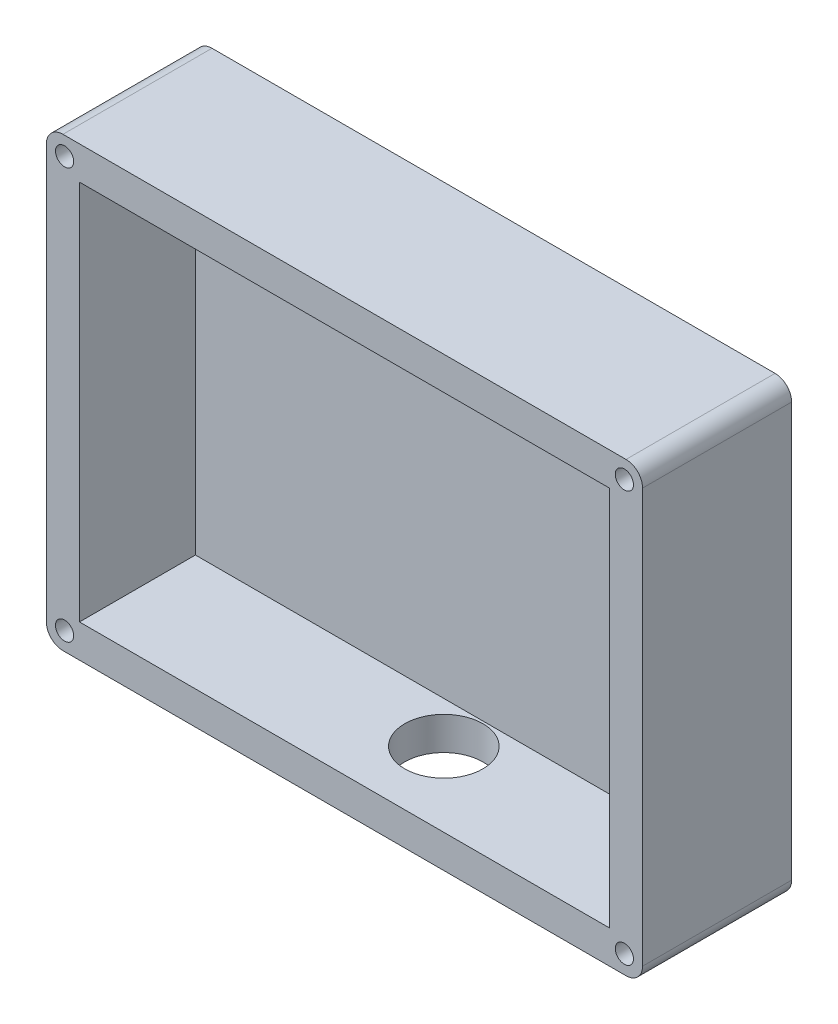
ISO-10303-21;
HEADER;
FILE_DESCRIPTION(('STEP AP214'),'2;1');
FILE_NAME('part.step','',(''),(''),'','','');
FILE_SCHEMA(('AUTOMOTIVE_DESIGN { 1 0 10303 214 1 1 1 1 }'));
ENDSEC;
DATA;
#1=APPLICATION_CONTEXT('core data for automotive mechanical design processes');
#2=APPLICATION_PROTOCOL_DEFINITION('international standard','automotive_design',2000,#1);
#3=PRODUCT_CONTEXT('',#1,'mechanical');
#4=PRODUCT('Part','Part','',(#3));
#5=PRODUCT_RELATED_PRODUCT_CATEGORY('part','',(#4));
#6=PRODUCT_DEFINITION_FORMATION('','',#4);
#7=PRODUCT_DEFINITION_CONTEXT('part definition',#1,'design');
#8=PRODUCT_DEFINITION('design','',#6,#7);
#9=PRODUCT_DEFINITION_SHAPE('','',#8);
#10=(LENGTH_UNIT() NAMED_UNIT(*) SI_UNIT(.MILLI.,.METRE.));
#11=(NAMED_UNIT(*) PLANE_ANGLE_UNIT() SI_UNIT($,.RADIAN.));
#12=(NAMED_UNIT(*) SI_UNIT($,.STERADIAN.) SOLID_ANGLE_UNIT());
#13=UNCERTAINTY_MEASURE_WITH_UNIT(LENGTH_MEASURE(1.E-05),#10,'distance_accuracy_value','');
#14=(GEOMETRIC_REPRESENTATION_CONTEXT(3) GLOBAL_UNCERTAINTY_ASSIGNED_CONTEXT((#13)) GLOBAL_UNIT_ASSIGNED_CONTEXT((#10,
#11,#12)) REPRESENTATION_CONTEXT('',''));
#15=CARTESIAN_POINT('',(0.,0.,0.));
#16=DIRECTION('',(0.,0.,1.));
#17=DIRECTION('',(1.,0.,0.));
#18=AXIS2_PLACEMENT_3D('',#15,#16,#17);
#19=CARTESIAN_POINT('',(0.,0.,-20.32));
#20=DIRECTION('',(0.,0.,-1.));
#21=DIRECTION('',(-1.,0.,0.));
#22=AXIS2_PLACEMENT_3D('',#19,#20,#21);
#23=PLANE('',#22);
#24=CARTESIAN_POINT('',(64.9097,-34.29,-20.32));
#25=DIRECTION('',(0.,0.,-1.));
#26=DIRECTION('',(-1.,0.,0.));
#27=AXIS2_PLACEMENT_3D('',#24,#25,#26);
#28=CIRCLE('',#27,1.26999999999999);
#29=CARTESIAN_POINT('',(63.6397,-34.29,-20.32));
#30=VERTEX_POINT('',#29);
#31=EDGE_CURVE('E425',#30,#30,#28,.T.);
#32=ORIENTED_EDGE('',*,*,#31,.F.);
#33=EDGE_LOOP('',(#32));
#34=FACE_BOUND('',#33,.T.);
#35=DIRECTION('',(0.,-1.,0.));
#36=VECTOR('',#35,1.);
#37=CARTESIAN_POINT('',(58.7121,0.,-20.32));
#38=LINE('',#37,#36);
#39=CARTESIAN_POINT('',(58.7121,-26.3525,-20.32));
#40=VERTEX_POINT('',#39);
#41=CARTESIAN_POINT('',(58.7121,-42.2275,-20.32));
#42=VERTEX_POINT('',#41);
#43=EDGE_CURVE('E178',#40,#42,#38,.T.);
#44=ORIENTED_EDGE('',*,*,#43,.F.);
#45=DIRECTION('',(1.,0.,0.));
#46=VECTOR('',#45,1.);
#47=CARTESIAN_POINT('',(20.32,-26.3525,-20.32));
#48=LINE('',#47,#46);
#49=CARTESIAN_POINT('',(71.12,-26.3525,-20.32));
#50=VERTEX_POINT('',#49);
#51=EDGE_CURVE('E447',#40,#50,#48,.T.);
#52=ORIENTED_EDGE('',*,*,#51,.T.);
#53=DIRECTION('',(0.,-1.,0.));
#54=VECTOR('',#53,1.);
#55=CARTESIAN_POINT('',(71.12,-42.2275,-20.32));
#56=LINE('',#55,#54);
#57=CARTESIAN_POINT('',(71.12,-42.2275,-20.32));
#58=VERTEX_POINT('',#57);
#59=EDGE_CURVE('E203',#50,#58,#56,.T.);
#60=ORIENTED_EDGE('',*,*,#59,.T.);
#61=DIRECTION('',(-1.,0.,0.));
#62=VECTOR('',#61,1.);
#63=CARTESIAN_POINT('',(20.32,-42.2275,-20.32));
#64=LINE('',#63,#62);
#65=EDGE_CURVE('E196',#58,#42,#64,.T.);
#66=ORIENTED_EDGE('',*,*,#65,.T.);
#67=EDGE_LOOP('',(#44,#52,#60,#66));
#68=FACE_BOUND('',#67,.T.);
#69=ADVANCED_FACE('F39',(#34,#68),#23,.T.);
#70=CARTESIAN_POINT('',(0.,0.,0.));
#71=DIRECTION('',(0.,0.,1.));
#72=DIRECTION('',(1.,0.,0.));
#73=AXIS2_PLACEMENT_3D('',#70,#71,#72);
#74=PLANE('',#73);
#75=DIRECTION('',(1.,0.,0.));
#76=VECTOR('',#75,1.);
#77=CARTESIAN_POINT('',(20.32,-23.8125,0.));
#78=LINE('',#77,#76);
#79=CARTESIAN_POINT('',(73.66,-23.8125,0.));
#80=VERTEX_POINT('',#79);
#81=CARTESIAN_POINT('',(17.78,-23.8125,0.));
#82=VERTEX_POINT('',#81);
#83=EDGE_CURVE('E394',#80,#82,#78,.F.);
#84=ORIENTED_EDGE('',*,*,#83,.T.);
#85=DIRECTION('',(0.,1.,0.));
#86=VECTOR('',#85,1.);
#87=CARTESIAN_POINT('',(17.78,-42.2275,0.));
#88=LINE('',#87,#86);
#89=CARTESIAN_POINT('',(17.78,-44.7675,0.));
#90=VERTEX_POINT('',#89);
#91=EDGE_CURVE('E403',#82,#90,#88,.F.);
#92=ORIENTED_EDGE('',*,*,#91,.T.);
#93=DIRECTION('',(-1.,0.,0.));
#94=VECTOR('',#93,1.);
#95=CARTESIAN_POINT('',(71.12,-44.7675,0.));
#96=LINE('',#95,#94);
#97=CARTESIAN_POINT('',(73.66,-44.7675,0.));
#98=VERTEX_POINT('',#97);
#99=EDGE_CURVE('E400',#90,#98,#96,.F.);
#100=ORIENTED_EDGE('',*,*,#99,.T.);
#101=DIRECTION('',(0.,-1.,0.));
#102=VECTOR('',#101,1.);
#103=CARTESIAN_POINT('',(73.66,-26.3525,0.));
#104=LINE('',#103,#102);
#105=EDGE_CURVE('E397',#98,#80,#104,.F.);
#106=ORIENTED_EDGE('',*,*,#105,.T.);
#107=EDGE_LOOP('',(#84,#92,#100,#106));
#108=FACE_BOUND('',#107,.T.);
#109=DIRECTION('',(1.,0.,0.));
#110=VECTOR('',#109,1.);
#111=CARTESIAN_POINT('',(0.,-68.58,0.));
#112=LINE('',#111,#110);
#113=CARTESIAN_POINT('',(2.54000000000001,-68.58,0.));
#114=VERTEX_POINT('',#113);
#115=CARTESIAN_POINT('',(88.9,-68.58,0.));
#116=VERTEX_POINT('',#115);
#117=EDGE_CURVE('E327',#114,#116,#112,.T.);
#118=ORIENTED_EDGE('',*,*,#117,.F.);
#119=CARTESIAN_POINT('',(2.54000000000001,-66.04,0.));
#120=DIRECTION('',(0.,0.,1.));
#121=DIRECTION('',(1.,0.,0.));
#122=AXIS2_PLACEMENT_3D('',#119,#120,#121);
#123=CIRCLE('',#122,2.54);
#124=CARTESIAN_POINT('',(0.,-66.04,0.));
#125=VERTEX_POINT('',#124);
#126=EDGE_CURVE('E353',#114,#125,#123,.F.);
#127=ORIENTED_EDGE('',*,*,#126,.T.);
#128=DIRECTION('',(0.,-1.,0.));
#129=VECTOR('',#128,1.);
#130=CARTESIAN_POINT('',(0.,0.,0.));
#131=LINE('',#130,#129);
#132=CARTESIAN_POINT('',(0.,-2.54,0.));
#133=VERTEX_POINT('',#132);
#134=EDGE_CURVE('E272',#133,#125,#131,.T.);
#135=ORIENTED_EDGE('',*,*,#134,.F.);
#136=CARTESIAN_POINT('',(2.54,-2.54,0.));
#137=DIRECTION('',(0.,0.,1.));
#138=DIRECTION('',(1.,0.,0.));
#139=AXIS2_PLACEMENT_3D('',#136,#137,#138);
#140=CIRCLE('',#139,2.54);
#141=CARTESIAN_POINT('',(2.54,0.,0.));
#142=VERTEX_POINT('',#141);
#143=EDGE_CURVE('E350',#133,#142,#140,.F.);
#144=ORIENTED_EDGE('',*,*,#143,.T.);
#145=DIRECTION('',(-1.,0.,0.));
#146=VECTOR('',#145,1.);
#147=CARTESIAN_POINT('',(0.,0.,0.));
#148=LINE('',#147,#146);
#149=CARTESIAN_POINT('',(88.9,0.,0.));
#150=VERTEX_POINT('',#149);
#151=EDGE_CURVE('E311',#150,#142,#148,.T.);
#152=ORIENTED_EDGE('',*,*,#151,.F.);
#153=CARTESIAN_POINT('',(88.9,-2.54,0.));
#154=DIRECTION('',(0.,0.,1.));
#155=DIRECTION('',(1.,0.,0.));
#156=AXIS2_PLACEMENT_3D('',#153,#154,#155);
#157=CIRCLE('',#156,2.54);
#158=CARTESIAN_POINT('',(91.44,-2.54,0.));
#159=VERTEX_POINT('',#158);
#160=EDGE_CURVE('E347',#150,#159,#157,.F.);
#161=ORIENTED_EDGE('',*,*,#160,.T.);
#162=DIRECTION('',(0.,1.,0.));
#163=VECTOR('',#162,1.);
#164=CARTESIAN_POINT('',(91.44,0.,0.));
#165=LINE('',#164,#163);
#166=CARTESIAN_POINT('',(91.44,-66.04,0.));
#167=VERTEX_POINT('',#166);
#168=EDGE_CURVE('E331',#167,#159,#165,.T.);
#169=ORIENTED_EDGE('',*,*,#168,.F.);
#170=CARTESIAN_POINT('',(88.9,-66.04,0.));
#171=DIRECTION('',(0.,0.,1.));
#172=DIRECTION('',(1.,0.,0.));
#173=AXIS2_PLACEMENT_3D('',#170,#171,#172);
#174=CIRCLE('',#173,2.54);
#175=EDGE_CURVE('E344',#167,#116,#174,.F.);
#176=ORIENTED_EDGE('',*,*,#175,.T.);
#177=EDGE_LOOP('',(#118,#127,#135,#144,#152,#161,#169,#176));
#178=FACE_BOUND('',#177,.T.);
#179=ADVANCED_FACE('F482',(#108,#178),#74,.F.);
#180=CARTESIAN_POINT('',(0.,0.,22.86));
#181=DIRECTION('',(1.,0.,0.));
#182=DIRECTION('',(0.,1.,0.));
#183=AXIS2_PLACEMENT_3D('',#180,#181,#182);
#184=PLANE('',#183);
#185=ORIENTED_EDGE('',*,*,#134,.T.);
#186=DIRECTION('',(0.,0.,-1.));
#187=VECTOR('',#186,1.);
#188=CARTESIAN_POINT('',(0.,-66.04,22.86));
#189=LINE('',#188,#187);
#190=CARTESIAN_POINT('',(0.,-66.04,22.86));
#191=VERTEX_POINT('',#190);
#192=EDGE_CURVE('E360',#125,#191,#189,.F.);
#193=ORIENTED_EDGE('',*,*,#192,.T.);
#194=DIRECTION('',(0.,-1.,0.));
#195=VECTOR('',#194,1.);
#196=CARTESIAN_POINT('',(0.,0.,22.86));
#197=LINE('',#196,#195);
#198=CARTESIAN_POINT('',(0.,-2.54,22.86));
#199=VERTEX_POINT('',#198);
#200=EDGE_CURVE('E306',#199,#191,#197,.T.);
#201=ORIENTED_EDGE('',*,*,#200,.F.);
#202=DIRECTION('',(0.,0.,-1.));
#203=VECTOR('',#202,1.);
#204=CARTESIAN_POINT('',(0.,-2.54,22.86));
#205=LINE('',#204,#203);
#206=EDGE_CURVE('E356',#199,#133,#205,.T.);
#207=ORIENTED_EDGE('',*,*,#206,.T.);
#208=EDGE_LOOP('',(#185,#193,#201,#207));
#209=FACE_BOUND('',#208,.T.);
#210=ADVANCED_FACE('F489',(#209),#184,.F.);
#211=CARTESIAN_POINT('',(0.,-68.58,22.86));
#212=DIRECTION('',(0.,1.,0.));
#213=DIRECTION('',(0.,0.,1.));
#214=AXIS2_PLACEMENT_3D('',#211,#212,#213);
#215=PLANE('',#214);
#216=CARTESIAN_POINT('',(49.53,-68.58,11.43));
#217=DIRECTION('',(0.,-1.,0.));
#218=DIRECTION('',(0.,0.,-1.));
#219=AXIS2_PLACEMENT_3D('',#216,#217,#218);
#220=CIRCLE('',#219,5.99999999999999);
#221=CARTESIAN_POINT('',(49.53,-68.58,5.43));
#222=VERTEX_POINT('',#221);
#223=EDGE_CURVE('E223',#222,#222,#220,.T.);
#224=ORIENTED_EDGE('',*,*,#223,.F.);
#225=EDGE_LOOP('',(#224));
#226=FACE_BOUND('',#225,.T.);
#227=DIRECTION('',(1.,0.,0.));
#228=VECTOR('',#227,1.);
#229=CARTESIAN_POINT('',(0.,-68.58,22.86));
#230=LINE('',#229,#228);
#231=CARTESIAN_POINT('',(2.54000000000001,-68.58,22.86));
#232=VERTEX_POINT('',#231);
#233=CARTESIAN_POINT('',(88.9,-68.58,22.86));
#234=VERTEX_POINT('',#233);
#235=EDGE_CURVE('E310',#232,#234,#230,.T.);
#236=ORIENTED_EDGE('',*,*,#235,.F.);
#237=DIRECTION('',(0.,0.,-1.));
#238=VECTOR('',#237,1.);
#239=CARTESIAN_POINT('',(2.54000000000001,-68.58,22.86));
#240=LINE('',#239,#238);
#241=EDGE_CURVE('E340',#232,#114,#240,.T.);
#242=ORIENTED_EDGE('',*,*,#241,.T.);
#243=ORIENTED_EDGE('',*,*,#117,.T.);
#244=DIRECTION('',(0.,0.,-1.));
#245=VECTOR('',#244,1.);
#246=CARTESIAN_POINT('',(88.9,-68.58,22.86));
#247=LINE('',#246,#245);
#248=EDGE_CURVE('E323',#116,#234,#247,.F.);
#249=ORIENTED_EDGE('',*,*,#248,.T.);
#250=EDGE_LOOP('',(#236,#242,#243,#249));
#251=FACE_BOUND('',#250,.T.);
#252=ADVANCED_FACE('F497',(#226,#251),#215,.F.);
#253=CARTESIAN_POINT('',(91.44,0.,22.86));
#254=DIRECTION('',(-1.,0.,0.));
#255=DIRECTION('',(0.,-1.,0.));
#256=AXIS2_PLACEMENT_3D('',#253,#254,#255);
#257=PLANE('',#256);
#258=ORIENTED_EDGE('',*,*,#168,.T.);
#259=DIRECTION('',(0.,0.,-1.));
#260=VECTOR('',#259,1.);
#261=CARTESIAN_POINT('',(91.44,-2.54,22.86));
#262=LINE('',#261,#260);
#263=CARTESIAN_POINT('',(91.44,-2.54,22.86));
#264=VERTEX_POINT('',#263);
#265=EDGE_CURVE('E386',#159,#264,#262,.F.);
#266=ORIENTED_EDGE('',*,*,#265,.T.);
#267=DIRECTION('',(0.,1.,0.));
#268=VECTOR('',#267,1.);
#269=CARTESIAN_POINT('',(91.44,0.,22.86));
#270=LINE('',#269,#268);
#271=CARTESIAN_POINT('',(91.44,-66.04,22.86));
#272=VERTEX_POINT('',#271);
#273=EDGE_CURVE('E315',#272,#264,#270,.T.);
#274=ORIENTED_EDGE('',*,*,#273,.F.);
#275=DIRECTION('',(0.,0.,-1.));
#276=VECTOR('',#275,1.);
#277=CARTESIAN_POINT('',(91.44,-66.04,22.86));
#278=LINE('',#277,#276);
#279=EDGE_CURVE('E382',#272,#167,#278,.T.);
#280=ORIENTED_EDGE('',*,*,#279,.T.);
#281=EDGE_LOOP('',(#258,#266,#274,#280));
#282=FACE_BOUND('',#281,.T.);
#283=ADVANCED_FACE('F508',(#282),#257,.F.);
#284=CARTESIAN_POINT('',(0.,0.,22.86));
#285=DIRECTION('',(0.,-1.,0.));
#286=DIRECTION('',(0.,0.,-1.));
#287=AXIS2_PLACEMENT_3D('',#284,#285,#286);
#288=PLANE('',#287);
#289=ORIENTED_EDGE('',*,*,#151,.T.);
#290=DIRECTION('',(0.,0.,-1.));
#291=VECTOR('',#290,1.);
#292=CARTESIAN_POINT('',(2.54,0.,22.86));
#293=LINE('',#292,#291);
#294=CARTESIAN_POINT('',(2.54,0.,22.86));
#295=VERTEX_POINT('',#294);
#296=EDGE_CURVE('E379',#142,#295,#293,.F.);
#297=ORIENTED_EDGE('',*,*,#296,.T.);
#298=DIRECTION('',(-1.,0.,0.));
#299=VECTOR('',#298,1.);
#300=CARTESIAN_POINT('',(0.,0.,22.86));
#301=LINE('',#300,#299);
#302=CARTESIAN_POINT('',(88.9,0.,22.86));
#303=VERTEX_POINT('',#302);
#304=EDGE_CURVE('E319',#303,#295,#301,.T.);
#305=ORIENTED_EDGE('',*,*,#304,.F.);
#306=DIRECTION('',(0.,0.,-1.));
#307=VECTOR('',#306,1.);
#308=CARTESIAN_POINT('',(88.9,0.,22.86));
#309=LINE('',#308,#307);
#310=EDGE_CURVE('E375',#303,#150,#309,.T.);
#311=ORIENTED_EDGE('',*,*,#310,.T.);
#312=EDGE_LOOP('',(#289,#297,#305,#311));
#313=FACE_BOUND('',#312,.T.);
#314=ADVANCED_FACE('F505',(#313),#288,.F.);
#315=CARTESIAN_POINT('',(0.,0.,22.86));
#316=DIRECTION('',(0.,0.,1.));
#317=DIRECTION('',(1.,0.,0.));
#318=AXIS2_PLACEMENT_3D('',#315,#316,#317);
#319=PLANE('',#318);
#320=CARTESIAN_POINT('',(2.794,-65.786,22.86));
#321=DIRECTION('',(0.,0.,1.));
#322=DIRECTION('',(1.,0.,0.));
#323=AXIS2_PLACEMENT_3D('',#320,#321,#322);
#324=CIRCLE('',#323,1.397);
#325=CARTESIAN_POINT('',(4.191,-65.786,22.86));
#326=VERTEX_POINT('',#325);
#327=EDGE_CURVE('E231',#326,#326,#324,.T.);
#328=ORIENTED_EDGE('',*,*,#327,.F.);
#329=EDGE_LOOP('',(#328));
#330=FACE_BOUND('',#329,.T.);
#331=CARTESIAN_POINT('',(88.646,-65.786,22.86));
#332=DIRECTION('',(0.,0.,1.));
#333=DIRECTION('',(1.,0.,0.));
#334=AXIS2_PLACEMENT_3D('',#331,#332,#333);
#335=CIRCLE('',#334,1.39699999999999);
#336=CARTESIAN_POINT('',(90.043,-65.786,22.86));
#337=VERTEX_POINT('',#336);
#338=EDGE_CURVE('E245',#337,#337,#335,.T.);
#339=ORIENTED_EDGE('',*,*,#338,.F.);
#340=EDGE_LOOP('',(#339));
#341=FACE_BOUND('',#340,.T.);
#342=CARTESIAN_POINT('',(88.646,-2.794,22.86));
#343=DIRECTION('',(0.,0.,1.));
#344=DIRECTION('',(1.,0.,0.));
#345=AXIS2_PLACEMENT_3D('',#342,#343,#344);
#346=CIRCLE('',#345,1.39699999999999);
#347=CARTESIAN_POINT('',(90.043,-2.794,22.86));
#348=VERTEX_POINT('',#347);
#349=EDGE_CURVE('E237',#348,#348,#346,.T.);
#350=ORIENTED_EDGE('',*,*,#349,.F.);
#351=EDGE_LOOP('',(#350));
#352=FACE_BOUND('',#351,.T.);
#353=CARTESIAN_POINT('',(2.794,-2.794,22.86));
#354=DIRECTION('',(0.,0.,1.));
#355=DIRECTION('',(1.,0.,0.));
#356=AXIS2_PLACEMENT_3D('',#353,#354,#355);
#357=CIRCLE('',#356,1.397);
#358=CARTESIAN_POINT('',(4.191,-2.794,22.86));
#359=VERTEX_POINT('',#358);
#360=EDGE_CURVE('E236',#359,#359,#357,.T.);
#361=ORIENTED_EDGE('',*,*,#360,.F.);
#362=EDGE_LOOP('',(#361));
#363=FACE_BOUND('',#362,.T.);
#364=DIRECTION('',(0.,-1.,0.));
#365=VECTOR('',#364,1.);
#366=CARTESIAN_POINT('',(5.08,0.,22.86));
#367=LINE('',#366,#365);
#368=CARTESIAN_POINT('',(5.08,-5.08,22.86));
#369=VERTEX_POINT('',#368);
#370=CARTESIAN_POINT('',(5.08000000000001,-63.5,22.86));
#371=VERTEX_POINT('',#370);
#372=EDGE_CURVE('E294',#369,#371,#367,.T.);
#373=ORIENTED_EDGE('',*,*,#372,.F.);
#374=DIRECTION('',(-1.,0.,0.));
#375=VECTOR('',#374,1.);
#376=CARTESIAN_POINT('',(0.,-5.08,22.86));
#377=LINE('',#376,#375);
#378=CARTESIAN_POINT('',(86.36,-5.08,22.86));
#379=VERTEX_POINT('',#378);
#380=EDGE_CURVE('E279',#379,#369,#377,.T.);
#381=ORIENTED_EDGE('',*,*,#380,.F.);
#382=DIRECTION('',(0.,1.,0.));
#383=VECTOR('',#382,1.);
#384=CARTESIAN_POINT('',(86.36,0.,22.86));
#385=LINE('',#384,#383);
#386=CARTESIAN_POINT('',(86.36,-63.5,22.86));
#387=VERTEX_POINT('',#386);
#388=EDGE_CURVE('E300',#387,#379,#385,.T.);
#389=ORIENTED_EDGE('',*,*,#388,.F.);
#390=DIRECTION('',(1.,0.,0.));
#391=VECTOR('',#390,1.);
#392=CARTESIAN_POINT('',(0.,-63.5,22.86));
#393=LINE('',#392,#391);
#394=EDGE_CURVE('E297',#371,#387,#393,.T.);
#395=ORIENTED_EDGE('',*,*,#394,.F.);
#396=EDGE_LOOP('',(#373,#381,#389,#395));
#397=FACE_BOUND('',#396,.T.);
#398=ORIENTED_EDGE('',*,*,#200,.T.);
#399=CARTESIAN_POINT('',(2.54000000000001,-66.04,22.86));
#400=DIRECTION('',(0.,0.,1.));
#401=DIRECTION('',(1.,0.,0.));
#402=AXIS2_PLACEMENT_3D('',#399,#400,#401);
#403=CIRCLE('',#402,2.54);
#404=EDGE_CURVE('E372',#191,#232,#403,.T.);
#405=ORIENTED_EDGE('',*,*,#404,.T.);
#406=ORIENTED_EDGE('',*,*,#235,.T.);
#407=CARTESIAN_POINT('',(88.9,-66.04,22.86));
#408=DIRECTION('',(0.,0.,1.));
#409=DIRECTION('',(1.,0.,0.));
#410=AXIS2_PLACEMENT_3D('',#407,#408,#409);
#411=CIRCLE('',#410,2.54);
#412=EDGE_CURVE('E363',#234,#272,#411,.T.);
#413=ORIENTED_EDGE('',*,*,#412,.T.);
#414=ORIENTED_EDGE('',*,*,#273,.T.);
#415=CARTESIAN_POINT('',(88.9,-2.54,22.86));
#416=DIRECTION('',(0.,0.,1.));
#417=DIRECTION('',(1.,0.,0.));
#418=AXIS2_PLACEMENT_3D('',#415,#416,#417);
#419=CIRCLE('',#418,2.54);
#420=EDGE_CURVE('E366',#264,#303,#419,.T.);
#421=ORIENTED_EDGE('',*,*,#420,.T.);
#422=ORIENTED_EDGE('',*,*,#304,.T.);
#423=CARTESIAN_POINT('',(2.54,-2.54,22.86));
#424=DIRECTION('',(0.,0.,1.));
#425=DIRECTION('',(1.,0.,0.));
#426=AXIS2_PLACEMENT_3D('',#423,#424,#425);
#427=CIRCLE('',#426,2.54);
#428=EDGE_CURVE('E369',#295,#199,#427,.T.);
#429=ORIENTED_EDGE('',*,*,#428,.T.);
#430=EDGE_LOOP('',(#398,#405,#406,#413,#414,#421,#422,#429));
#431=FACE_BOUND('',#430,.T.);
#432=ADVANCED_FACE('F503',(#330,#341,#352,#363,#397,#431),#319,.T.);
#433=CARTESIAN_POINT('',(5.08,0.,22.86));
#434=DIRECTION('',(1.,0.,0.));
#435=DIRECTION('',(0.,1.,0.));
#436=AXIS2_PLACEMENT_3D('',#433,#434,#435);
#437=PLANE('',#436);
#438=DIRECTION('',(0.,-1.,0.));
#439=VECTOR('',#438,1.);
#440=CARTESIAN_POINT('',(5.08,0.,5.08));
#441=LINE('',#440,#439);
#442=CARTESIAN_POINT('',(5.08,-5.08,5.08));
#443=VERTEX_POINT('',#442);
#444=CARTESIAN_POINT('',(5.08000000000001,-63.5,5.08));
#445=VERTEX_POINT('',#444);
#446=EDGE_CURVE('E260',#443,#445,#441,.T.);
#447=ORIENTED_EDGE('',*,*,#446,.F.);
#448=DIRECTION('',(0.,0.,-1.));
#449=VECTOR('',#448,1.);
#450=CARTESIAN_POINT('',(5.08,-5.08,22.86));
#451=LINE('',#450,#449);
#452=EDGE_CURVE('E274',#369,#443,#451,.T.);
#453=ORIENTED_EDGE('',*,*,#452,.F.);
#454=ORIENTED_EDGE('',*,*,#372,.T.);
#455=DIRECTION('',(0.,0.,-1.));
#456=VECTOR('',#455,1.);
#457=CARTESIAN_POINT('',(5.08000000000001,-63.5,22.86));
#458=LINE('',#457,#456);
#459=EDGE_CURVE('E268',#371,#445,#458,.T.);
#460=ORIENTED_EDGE('',*,*,#459,.T.);
#461=EDGE_LOOP('',(#447,#453,#454,#460));
#462=FACE_BOUND('',#461,.T.);
#463=ADVANCED_FACE('F666',(#462),#437,.T.);
#464=CARTESIAN_POINT('',(0.,-63.5,22.86));
#465=DIRECTION('',(0.,1.,0.));
#466=DIRECTION('',(0.,0.,1.));
#467=AXIS2_PLACEMENT_3D('',#464,#465,#466);
#468=PLANE('',#467);
#469=CARTESIAN_POINT('',(49.53,-63.5,11.43));
#470=DIRECTION('',(0.,1.,0.));
#471=DIRECTION('',(0.,0.,1.));
#472=AXIS2_PLACEMENT_3D('',#469,#470,#471);
#473=CIRCLE('',#472,5.99999999999999);
#474=CARTESIAN_POINT('',(49.53,-63.5,17.43));
#475=VERTEX_POINT('',#474);
#476=EDGE_CURVE('E227',#475,#475,#473,.F.);
#477=ORIENTED_EDGE('',*,*,#476,.T.);
#478=EDGE_LOOP('',(#477));
#479=FACE_BOUND('',#478,.T.);
#480=DIRECTION('',(1.,0.,0.));
#481=VECTOR('',#480,1.);
#482=CARTESIAN_POINT('',(0.,-63.5,5.08));
#483=LINE('',#482,#481);
#484=CARTESIAN_POINT('',(86.36,-63.5,5.08));
#485=VERTEX_POINT('',#484);
#486=EDGE_CURVE('E267',#445,#485,#483,.T.);
#487=ORIENTED_EDGE('',*,*,#486,.F.);
#488=ORIENTED_EDGE('',*,*,#459,.F.);
#489=ORIENTED_EDGE('',*,*,#394,.T.);
#490=DIRECTION('',(0.,0.,-1.));
#491=VECTOR('',#490,1.);
#492=CARTESIAN_POINT('',(86.36,-63.5,22.86));
#493=LINE('',#492,#491);
#494=EDGE_CURVE('E273',#387,#485,#493,.T.);
#495=ORIENTED_EDGE('',*,*,#494,.T.);
#496=EDGE_LOOP('',(#487,#488,#489,#495));
#497=FACE_BOUND('',#496,.T.);
#498=ADVANCED_FACE('F644',(#479,#497),#468,.T.);
#499=CARTESIAN_POINT('',(86.36,0.,22.86));
#500=DIRECTION('',(-1.,0.,0.));
#501=DIRECTION('',(0.,-1.,0.));
#502=AXIS2_PLACEMENT_3D('',#499,#500,#501);
#503=PLANE('',#502);
#504=DIRECTION('',(0.,1.,0.));
#505=VECTOR('',#504,1.);
#506=CARTESIAN_POINT('',(86.36,0.,5.08));
#507=LINE('',#506,#505);
#508=CARTESIAN_POINT('',(86.36,-5.08,5.08));
#509=VERTEX_POINT('',#508);
#510=EDGE_CURVE('E282',#485,#509,#507,.T.);
#511=ORIENTED_EDGE('',*,*,#510,.F.);
#512=ORIENTED_EDGE('',*,*,#494,.F.);
#513=ORIENTED_EDGE('',*,*,#388,.T.);
#514=DIRECTION('',(0.,0.,-1.));
#515=VECTOR('',#514,1.);
#516=CARTESIAN_POINT('',(86.36,-5.08,22.86));
#517=LINE('',#516,#515);
#518=EDGE_CURVE('E278',#379,#509,#517,.T.);
#519=ORIENTED_EDGE('',*,*,#518,.T.);
#520=EDGE_LOOP('',(#511,#512,#513,#519));
#521=FACE_BOUND('',#520,.T.);
#522=ADVANCED_FACE('F665',(#521),#503,.T.);
#523=CARTESIAN_POINT('',(0.,-5.08,22.86));
#524=DIRECTION('',(0.,-1.,0.));
#525=DIRECTION('',(0.,0.,-1.));
#526=AXIS2_PLACEMENT_3D('',#523,#524,#525);
#527=PLANE('',#526);
#528=DIRECTION('',(-1.,0.,0.));
#529=VECTOR('',#528,1.);
#530=CARTESIAN_POINT('',(0.,-5.08,5.08));
#531=LINE('',#530,#529);
#532=EDGE_CURVE('E288',#509,#443,#531,.T.);
#533=ORIENTED_EDGE('',*,*,#532,.F.);
#534=ORIENTED_EDGE('',*,*,#518,.F.);
#535=ORIENTED_EDGE('',*,*,#380,.T.);
#536=ORIENTED_EDGE('',*,*,#452,.T.);
#537=EDGE_LOOP('',(#533,#534,#535,#536));
#538=FACE_BOUND('',#537,.T.);
#539=ADVANCED_FACE('F812',(#538),#527,.T.);
#540=CARTESIAN_POINT('',(0.,0.,5.08));
#541=DIRECTION('',(0.,0.,1.));
#542=DIRECTION('',(1.,0.,0.));
#543=AXIS2_PLACEMENT_3D('',#540,#541,#542);
#544=PLANE('',#543);
#545=ORIENTED_EDGE('',*,*,#446,.T.);
#546=ORIENTED_EDGE('',*,*,#486,.T.);
#547=ORIENTED_EDGE('',*,*,#510,.T.);
#548=ORIENTED_EDGE('',*,*,#532,.T.);
#549=EDGE_LOOP('',(#545,#546,#547,#548));
#550=FACE_BOUND('',#549,.T.);
#551=ADVANCED_FACE('F802',(#550),#544,.T.);
#552=CARTESIAN_POINT('',(2.794,-2.794,14.7955));
#553=DIRECTION('',(0.,0.,1.));
#554=DIRECTION('',(1.,0.,0.));
#555=AXIS2_PLACEMENT_3D('',#552,#553,#554);
#556=CYLINDRICAL_SURFACE('',#555,1.397);
#557=CARTESIAN_POINT('',(2.794,-2.794,14.7955));
#558=DIRECTION('',(0.,0.,1.));
#559=DIRECTION('',(1.,0.,0.));
#560=AXIS2_PLACEMENT_3D('',#557,#558,#559);
#561=CIRCLE('',#560,1.397);
#562=CARTESIAN_POINT('',(4.191,-2.794,14.7955));
#563=VERTEX_POINT('',#562);
#564=EDGE_CURVE('E256',#563,#563,#561,.T.);
#565=ORIENTED_EDGE('',*,*,#564,.F.);
#566=EDGE_LOOP('',(#565));
#567=FACE_BOUND('',#566,.T.);
#568=ORIENTED_EDGE('',*,*,#360,.T.);
#569=EDGE_LOOP('',(#568));
#570=FACE_BOUND('',#569,.T.);
#571=ADVANCED_FACE('F792',(#567,#570),#556,.F.);
#572=CARTESIAN_POINT('',(2.794,-2.794,14.7955));
#573=DIRECTION('',(0.,0.,1.));
#574=DIRECTION('',(1.,0.,0.));
#575=AXIS2_PLACEMENT_3D('',#572,#573,#574);
#576=PLANE('',#575);
#577=ORIENTED_EDGE('',*,*,#564,.T.);
#578=EDGE_LOOP('',(#577));
#579=FACE_BOUND('',#578,.T.);
#580=ADVANCED_FACE('F782',(#579),#576,.T.);
#581=CARTESIAN_POINT('',(88.646,-2.794,14.7955));
#582=DIRECTION('',(0.,0.,1.));
#583=DIRECTION('',(1.,0.,0.));
#584=AXIS2_PLACEMENT_3D('',#581,#582,#583);
#585=CYLINDRICAL_SURFACE('',#584,1.39699999999999);
#586=CARTESIAN_POINT('',(88.646,-2.794,14.7955));
#587=DIRECTION('',(0.,0.,1.));
#588=DIRECTION('',(1.,0.,0.));
#589=AXIS2_PLACEMENT_3D('',#586,#587,#588);
#590=CIRCLE('',#589,1.39699999999999);
#591=CARTESIAN_POINT('',(90.043,-2.794,14.7955));
#592=VERTEX_POINT('',#591);
#593=EDGE_CURVE('E232',#592,#592,#590,.T.);
#594=ORIENTED_EDGE('',*,*,#593,.F.);
#595=EDGE_LOOP('',(#594));
#596=FACE_BOUND('',#595,.T.);
#597=ORIENTED_EDGE('',*,*,#349,.T.);
#598=EDGE_LOOP('',(#597));
#599=FACE_BOUND('',#598,.T.);
#600=ADVANCED_FACE('F772',(#596,#599),#585,.F.);
#601=CARTESIAN_POINT('',(88.646,-2.794,14.7955));
#602=DIRECTION('',(0.,0.,1.));
#603=DIRECTION('',(1.,0.,0.));
#604=AXIS2_PLACEMENT_3D('',#601,#602,#603);
#605=PLANE('',#604);
#606=ORIENTED_EDGE('',*,*,#593,.T.);
#607=EDGE_LOOP('',(#606));
#608=FACE_BOUND('',#607,.T.);
#609=ADVANCED_FACE('F762',(#608),#605,.T.);
#610=CARTESIAN_POINT('',(88.646,-65.786,14.7955));
#611=DIRECTION('',(0.,0.,1.));
#612=DIRECTION('',(1.,0.,0.));
#613=AXIS2_PLACEMENT_3D('',#610,#611,#612);
#614=CYLINDRICAL_SURFACE('',#613,1.39699999999999);
#615=CARTESIAN_POINT('',(88.646,-65.786,14.7955));
#616=DIRECTION('',(0.,0.,1.));
#617=DIRECTION('',(1.,0.,0.));
#618=AXIS2_PLACEMENT_3D('',#615,#616,#617);
#619=CIRCLE('',#618,1.39699999999999);
#620=CARTESIAN_POINT('',(90.043,-65.786,14.7955));
#621=VERTEX_POINT('',#620);
#622=EDGE_CURVE('E241',#621,#621,#619,.T.);
#623=ORIENTED_EDGE('',*,*,#622,.F.);
#624=EDGE_LOOP('',(#623));
#625=FACE_BOUND('',#624,.T.);
#626=ORIENTED_EDGE('',*,*,#338,.T.);
#627=EDGE_LOOP('',(#626));
#628=FACE_BOUND('',#627,.T.);
#629=ADVANCED_FACE('F752',(#625,#628),#614,.F.);
#630=CARTESIAN_POINT('',(88.646,-65.786,14.7955));
#631=DIRECTION('',(0.,0.,1.));
#632=DIRECTION('',(1.,0.,0.));
#633=AXIS2_PLACEMENT_3D('',#630,#631,#632);
#634=PLANE('',#633);
#635=ORIENTED_EDGE('',*,*,#622,.T.);
#636=EDGE_LOOP('',(#635));
#637=FACE_BOUND('',#636,.T.);
#638=ADVANCED_FACE('F742',(#637),#634,.T.);
#639=CARTESIAN_POINT('',(2.794,-65.786,14.7955));
#640=DIRECTION('',(0.,0.,1.));
#641=DIRECTION('',(1.,0.,0.));
#642=AXIS2_PLACEMENT_3D('',#639,#640,#641);
#643=CYLINDRICAL_SURFACE('',#642,1.397);
#644=CARTESIAN_POINT('',(2.794,-65.786,14.7955));
#645=DIRECTION('',(0.,0.,1.));
#646=DIRECTION('',(1.,0.,0.));
#647=AXIS2_PLACEMENT_3D('',#644,#645,#646);
#648=CIRCLE('',#647,1.397);
#649=CARTESIAN_POINT('',(4.191,-65.786,14.7955));
#650=VERTEX_POINT('',#649);
#651=EDGE_CURVE('E249',#650,#650,#648,.T.);
#652=ORIENTED_EDGE('',*,*,#651,.F.);
#653=EDGE_LOOP('',(#652));
#654=FACE_BOUND('',#653,.T.);
#655=ORIENTED_EDGE('',*,*,#327,.T.);
#656=EDGE_LOOP('',(#655));
#657=FACE_BOUND('',#656,.T.);
#658=ADVANCED_FACE('F732',(#654,#657),#643,.F.);
#659=CARTESIAN_POINT('',(2.794,-65.786,14.7955));
#660=DIRECTION('',(0.,0.,1.));
#661=DIRECTION('',(1.,0.,0.));
#662=AXIS2_PLACEMENT_3D('',#659,#660,#661);
#663=PLANE('',#662);
#664=ORIENTED_EDGE('',*,*,#651,.T.);
#665=EDGE_LOOP('',(#664));
#666=FACE_BOUND('',#665,.T.);
#667=ADVANCED_FACE('F520',(#666),#663,.T.);
#668=CARTESIAN_POINT('',(2.54000000000001,-66.04,22.86));
#669=DIRECTION('',(0.,0.,-1.));
#670=DIRECTION('',(-1.,0.,0.));
#671=AXIS2_PLACEMENT_3D('',#668,#669,#670);
#672=CYLINDRICAL_SURFACE('',#671,2.54);
#673=ORIENTED_EDGE('',*,*,#404,.F.);
#674=ORIENTED_EDGE('',*,*,#192,.F.);
#675=ORIENTED_EDGE('',*,*,#126,.F.);
#676=ORIENTED_EDGE('',*,*,#241,.F.);
#677=EDGE_LOOP('',(#673,#674,#675,#676));
#678=FACE_BOUND('',#677,.T.);
#679=ADVANCED_FACE('F516',(#678),#672,.T.);
#680=CARTESIAN_POINT('',(2.54,-2.54,22.86));
#681=DIRECTION('',(0.,0.,-1.));
#682=DIRECTION('',(-1.,0.,0.));
#683=AXIS2_PLACEMENT_3D('',#680,#681,#682);
#684=CYLINDRICAL_SURFACE('',#683,2.54);
#685=ORIENTED_EDGE('',*,*,#428,.F.);
#686=ORIENTED_EDGE('',*,*,#296,.F.);
#687=ORIENTED_EDGE('',*,*,#143,.F.);
#688=ORIENTED_EDGE('',*,*,#206,.F.);
#689=EDGE_LOOP('',(#685,#686,#687,#688));
#690=FACE_BOUND('',#689,.T.);
#691=ADVANCED_FACE('F519',(#690),#684,.T.);
#692=CARTESIAN_POINT('',(88.9,-2.54,22.86));
#693=DIRECTION('',(0.,0.,-1.));
#694=DIRECTION('',(-1.,0.,0.));
#695=AXIS2_PLACEMENT_3D('',#692,#693,#694);
#696=CYLINDRICAL_SURFACE('',#695,2.54);
#697=ORIENTED_EDGE('',*,*,#420,.F.);
#698=ORIENTED_EDGE('',*,*,#265,.F.);
#699=ORIENTED_EDGE('',*,*,#160,.F.);
#700=ORIENTED_EDGE('',*,*,#310,.F.);
#701=EDGE_LOOP('',(#697,#698,#699,#700));
#702=FACE_BOUND('',#701,.T.);
#703=ADVANCED_FACE('F524',(#702),#696,.T.);
#704=CARTESIAN_POINT('',(88.9,-66.04,22.86));
#705=DIRECTION('',(0.,0.,-1.));
#706=DIRECTION('',(-1.,0.,0.));
#707=AXIS2_PLACEMENT_3D('',#704,#705,#706);
#708=CYLINDRICAL_SURFACE('',#707,2.54);
#709=ORIENTED_EDGE('',*,*,#412,.F.);
#710=ORIENTED_EDGE('',*,*,#248,.F.);
#711=ORIENTED_EDGE('',*,*,#175,.F.);
#712=ORIENTED_EDGE('',*,*,#279,.F.);
#713=EDGE_LOOP('',(#709,#710,#711,#712));
#714=FACE_BOUND('',#713,.T.);
#715=ADVANCED_FACE('F528',(#714),#708,.T.);
#716=CARTESIAN_POINT('',(49.53,-46.5294372515229,11.43));
#717=DIRECTION('',(0.,-1.,0.));
#718=DIRECTION('',(0.,0.,-1.));
#719=AXIS2_PLACEMENT_3D('',#716,#717,#718);
#720=CYLINDRICAL_SURFACE('',#719,5.99999999999999);
#721=ORIENTED_EDGE('',*,*,#223,.T.);
#722=EDGE_LOOP('',(#721));
#723=FACE_BOUND('',#722,.T.);
#724=ORIENTED_EDGE('',*,*,#476,.F.);
#725=EDGE_LOOP('',(#724));
#726=FACE_BOUND('',#725,.T.);
#727=ADVANCED_FACE('F532',(#723,#726),#720,.F.);
#728=CARTESIAN_POINT('',(20.32,-42.2275,-20.32));
#729=DIRECTION('',(1.,0.,0.));
#730=DIRECTION('',(0.,1.,0.));
#731=AXIS2_PLACEMENT_3D('',#728,#729,#730);
#732=PLANE('',#731);
#733=DIRECTION('',(0.,0.,1.));
#734=VECTOR('',#733,1.);
#735=CARTESIAN_POINT('',(20.32,-42.2275,-20.32));
#736=LINE('',#735,#734);
#737=CARTESIAN_POINT('',(20.32,-42.2275,-20.32));
#738=VERTEX_POINT('',#737);
#739=CARTESIAN_POINT('',(20.32,-42.2275,-2.54));
#740=VERTEX_POINT('',#739);
#741=EDGE_CURVE('E205',#738,#740,#736,.T.);
#742=ORIENTED_EDGE('',*,*,#741,.T.);
#743=DIRECTION('',(0.,1.,0.));
#744=VECTOR('',#743,1.);
#745=CARTESIAN_POINT('',(20.32,-26.3525,-2.54));
#746=LINE('',#745,#744);
#747=CARTESIAN_POINT('',(20.32,-26.3525,-2.54));
#748=VERTEX_POINT('',#747);
#749=EDGE_CURVE('E189',#740,#748,#746,.T.);
#750=ORIENTED_EDGE('',*,*,#749,.T.);
#751=DIRECTION('',(0.,0.,1.));
#752=VECTOR('',#751,1.);
#753=CARTESIAN_POINT('',(20.32,-26.3525,-20.32));
#754=LINE('',#753,#752);
#755=CARTESIAN_POINT('',(20.32,-26.3525,-20.32));
#756=VERTEX_POINT('',#755);
#757=EDGE_CURVE('E220',#756,#748,#754,.T.);
#758=ORIENTED_EDGE('',*,*,#757,.F.);
#759=DIRECTION('',(0.,1.,0.));
#760=VECTOR('',#759,1.);
#761=CARTESIAN_POINT('',(20.32,-42.2275,-20.32));
#762=LINE('',#761,#760);
#763=EDGE_CURVE('E444',#738,#756,#762,.T.);
#764=ORIENTED_EDGE('',*,*,#763,.F.);
#765=EDGE_LOOP('',(#742,#750,#758,#764));
#766=FACE_BOUND('',#765,.T.);
#767=ADVANCED_FACE('F467',(#766),#732,.F.);
#768=CARTESIAN_POINT('',(20.32,-26.3525,-20.32));
#769=DIRECTION('',(0.,-1.,0.));
#770=DIRECTION('',(1.,0.,0.));
#771=AXIS2_PLACEMENT_3D('',#768,#769,#770);
#772=PLANE('',#771);
#773=ORIENTED_EDGE('',*,*,#757,.T.);
#774=DIRECTION('',(1.,0.,0.));
#775=VECTOR('',#774,1.);
#776=CARTESIAN_POINT('',(71.12,-26.3525,-2.54));
#777=LINE('',#776,#775);
#778=CARTESIAN_POINT('',(71.12,-26.3525,-2.54));
#779=VERTEX_POINT('',#778);
#780=EDGE_CURVE('E11',#748,#779,#777,.T.);
#781=ORIENTED_EDGE('',*,*,#780,.T.);
#782=DIRECTION('',(0.,0.,1.));
#783=VECTOR('',#782,1.);
#784=CARTESIAN_POINT('',(71.12,-26.3525,-20.32));
#785=LINE('',#784,#783);
#786=EDGE_CURVE('E217',#50,#779,#785,.T.);
#787=ORIENTED_EDGE('',*,*,#786,.F.);
#788=ORIENTED_EDGE('',*,*,#51,.F.);
#789=CARTESIAN_POINT('',(45.72,-26.3525,-20.32));
#790=DIRECTION('',(0.,-1.,0.));
#791=DIRECTION('',(1.,0.,0.));
#792=AXIS2_PLACEMENT_3D('',#789,#790,#791);
#793=CIRCLE('',#792,12.9921);
#794=CARTESIAN_POINT('',(32.7279,-26.3525,-20.32));
#795=VERTEX_POINT('',#794);
#796=EDGE_CURVE('E184',#40,#795,#793,.T.);
#797=ORIENTED_EDGE('',*,*,#796,.T.);
#798=EDGE_CURVE('E448',#756,#795,#48,.T.);
#799=ORIENTED_EDGE('',*,*,#798,.F.);
#800=EDGE_LOOP('',(#773,#781,#787,#788,#797,#799));
#801=FACE_BOUND('',#800,.T.);
#802=ADVANCED_FACE('F454',(#801),#772,.F.);
#803=CARTESIAN_POINT('',(71.12,-42.2275,-20.32));
#804=DIRECTION('',(-1.,0.,0.));
#805=DIRECTION('',(0.,-1.,0.));
#806=AXIS2_PLACEMENT_3D('',#803,#804,#805);
#807=PLANE('',#806);
#808=ORIENTED_EDGE('',*,*,#786,.T.);
#809=DIRECTION('',(0.,-1.,0.));
#810=VECTOR('',#809,1.);
#811=CARTESIAN_POINT('',(71.12,-42.2275,-2.54));
#812=LINE('',#811,#810);
#813=CARTESIAN_POINT('',(71.12,-42.2275,-2.54));
#814=VERTEX_POINT('',#813);
#815=EDGE_CURVE('E49',#779,#814,#812,.T.);
#816=ORIENTED_EDGE('',*,*,#815,.T.);
#817=DIRECTION('',(0.,0.,1.));
#818=VECTOR('',#817,1.);
#819=CARTESIAN_POINT('',(71.12,-42.2275,-20.32));
#820=LINE('',#819,#818);
#821=EDGE_CURVE('E210',#58,#814,#820,.T.);
#822=ORIENTED_EDGE('',*,*,#821,.F.);
#823=ORIENTED_EDGE('',*,*,#59,.F.);
#824=EDGE_LOOP('',(#808,#816,#822,#823));
#825=FACE_BOUND('',#824,.T.);
#826=ADVANCED_FACE('F455',(#825),#807,.F.);
#827=CARTESIAN_POINT('',(20.32,-42.2275,-20.32));
#828=DIRECTION('',(0.,1.,0.));
#829=DIRECTION('',(-1.,0.,0.));
#830=AXIS2_PLACEMENT_3D('',#827,#828,#829);
#831=PLANE('',#830);
#832=ORIENTED_EDGE('',*,*,#821,.T.);
#833=DIRECTION('',(-1.,0.,0.));
#834=VECTOR('',#833,1.);
#835=CARTESIAN_POINT('',(20.32,-42.2275,-2.54));
#836=LINE('',#835,#834);
#837=EDGE_CURVE('E407',#814,#740,#836,.T.);
#838=ORIENTED_EDGE('',*,*,#837,.T.);
#839=ORIENTED_EDGE('',*,*,#741,.F.);
#840=CARTESIAN_POINT('',(32.7279,-42.2275,-20.32));
#841=VERTEX_POINT('',#840);
#842=EDGE_CURVE('E198',#841,#738,#64,.T.);
#843=ORIENTED_EDGE('',*,*,#842,.F.);
#844=CARTESIAN_POINT('',(45.72,-42.2275,-20.32));
#845=DIRECTION('',(0.,-1.,0.));
#846=DIRECTION('',(1.,0.,0.));
#847=AXIS2_PLACEMENT_3D('',#844,#845,#846);
#848=CIRCLE('',#847,12.9921);
#849=EDGE_CURVE('E181',#42,#841,#848,.T.);
#850=ORIENTED_EDGE('',*,*,#849,.F.);
#851=ORIENTED_EDGE('',*,*,#65,.F.);
#852=EDGE_LOOP('',(#832,#838,#839,#843,#850,#851));
#853=FACE_BOUND('',#852,.T.);
#854=ADVANCED_FACE('F195',(#853),#831,.F.);
#855=CARTESIAN_POINT('',(26.5176,-34.29,-20.32));
#856=DIRECTION('',(0.,0.,-1.));
#857=DIRECTION('',(-1.,0.,0.));
#858=AXIS2_PLACEMENT_3D('',#855,#856,#857);
#859=CIRCLE('',#858,1.27);
#860=CARTESIAN_POINT('',(25.2476,-34.29,-20.32));
#861=VERTEX_POINT('',#860);
#862=EDGE_CURVE('E438',#861,#861,#859,.T.);
#863=ORIENTED_EDGE('',*,*,#862,.F.);
#864=EDGE_LOOP('',(#863));
#865=FACE_BOUND('',#864,.T.);
#866=DIRECTION('',(0.,-1.,0.));
#867=VECTOR('',#866,1.);
#868=CARTESIAN_POINT('',(32.7279,0.,-20.32));
#869=LINE('',#868,#867);
#870=EDGE_CURVE('E190',#841,#795,#869,.F.);
#871=ORIENTED_EDGE('',*,*,#870,.F.);
#872=ORIENTED_EDGE('',*,*,#842,.T.);
#873=ORIENTED_EDGE('',*,*,#763,.T.);
#874=ORIENTED_EDGE('',*,*,#798,.T.);
#875=EDGE_LOOP('',(#871,#872,#873,#874));
#876=FACE_BOUND('',#875,.T.);
#877=ADVANCED_FACE('F469',(#865,#876),#23,.T.);
#878=CARTESIAN_POINT('',(45.72,0.,-20.32));
#879=DIRECTION('',(0.,-1.,0.));
#880=DIRECTION('',(1.,0.,0.));
#881=AXIS2_PLACEMENT_3D('',#878,#879,#880);
#882=CYLINDRICAL_SURFACE('',#881,12.9921);
#883=ORIENTED_EDGE('',*,*,#43,.T.);
#884=ORIENTED_EDGE('',*,*,#849,.T.);
#885=ORIENTED_EDGE('',*,*,#870,.T.);
#886=ORIENTED_EDGE('',*,*,#796,.F.);
#887=EDGE_LOOP('',(#883,#884,#885,#886));
#888=FACE_BOUND('',#887,.T.);
#889=ADVANCED_FACE('F180',(#888),#882,.F.);
#890=CARTESIAN_POINT('',(26.5176,-34.29,-7.6962));
#891=DIRECTION('',(0.,0.,-1.));
#892=DIRECTION('',(-1.,0.,0.));
#893=AXIS2_PLACEMENT_3D('',#890,#891,#892);
#894=CYLINDRICAL_SURFACE('',#893,1.27);
#895=CARTESIAN_POINT('',(26.5176,-34.29,-7.6962));
#896=DIRECTION('',(0.,0.,-1.));
#897=DIRECTION('',(-1.,0.,0.));
#898=AXIS2_PLACEMENT_3D('',#895,#896,#897);
#899=CIRCLE('',#898,1.27);
#900=CARTESIAN_POINT('',(25.2476,-34.29,-7.6962));
#901=VERTEX_POINT('',#900);
#902=EDGE_CURVE('E200',#901,#901,#899,.T.);
#903=ORIENTED_EDGE('',*,*,#902,.F.);
#904=EDGE_LOOP('',(#903));
#905=FACE_BOUND('',#904,.T.);
#906=ORIENTED_EDGE('',*,*,#862,.T.);
#907=EDGE_LOOP('',(#906));
#908=FACE_BOUND('',#907,.T.);
#909=ADVANCED_FACE('F477',(#905,#908),#894,.F.);
#910=CARTESIAN_POINT('',(26.5176,-34.29,-7.6962));
#911=DIRECTION('',(0.,0.,-1.));
#912=DIRECTION('',(-1.,0.,0.));
#913=AXIS2_PLACEMENT_3D('',#910,#911,#912);
#914=PLANE('',#913);
#915=ORIENTED_EDGE('',*,*,#902,.T.);
#916=EDGE_LOOP('',(#915));
#917=FACE_BOUND('',#916,.T.);
#918=ADVANCED_FACE('F551',(#917),#914,.T.);
#919=CARTESIAN_POINT('',(64.9097,-34.29,-7.6962));
#920=DIRECTION('',(0.,0.,-1.));
#921=DIRECTION('',(-1.,0.,0.));
#922=AXIS2_PLACEMENT_3D('',#919,#920,#921);
#923=CYLINDRICAL_SURFACE('',#922,1.26999999999999);
#924=CARTESIAN_POINT('',(64.9097,-34.29,-7.6962));
#925=DIRECTION('',(0.,0.,-1.));
#926=DIRECTION('',(-1.,0.,0.));
#927=AXIS2_PLACEMENT_3D('',#924,#925,#926);
#928=CIRCLE('',#927,1.26999999999999);
#929=CARTESIAN_POINT('',(63.6397,-34.29,-7.6962));
#930=VERTEX_POINT('',#929);
#931=EDGE_CURVE('E432',#930,#930,#928,.T.);
#932=ORIENTED_EDGE('',*,*,#931,.F.);
#933=EDGE_LOOP('',(#932));
#934=FACE_BOUND('',#933,.T.);
#935=ORIENTED_EDGE('',*,*,#31,.T.);
#936=EDGE_LOOP('',(#935));
#937=FACE_BOUND('',#936,.T.);
#938=ADVANCED_FACE('F546',(#934,#937),#923,.F.);
#939=CARTESIAN_POINT('',(64.9097,-34.29,-7.6962));
#940=DIRECTION('',(0.,0.,-1.));
#941=DIRECTION('',(-1.,0.,0.));
#942=AXIS2_PLACEMENT_3D('',#939,#940,#941);
#943=PLANE('',#942);
#944=ORIENTED_EDGE('',*,*,#931,.T.);
#945=EDGE_LOOP('',(#944));
#946=FACE_BOUND('',#945,.T.);
#947=ADVANCED_FACE('F542',(#946),#943,.T.);
#948=CARTESIAN_POINT('',(73.66,-42.2275,-2.54));
#949=DIRECTION('',(0.,1.,0.));
#950=DIRECTION('',(-1.,0.,0.));
#951=AXIS2_PLACEMENT_3D('',#948,#949,#950);
#952=CYLINDRICAL_SURFACE('',#951,2.54);
#953=CARTESIAN_POINT('',(73.66,-23.8125,-2.54));
#954=DIRECTION('',(-0.707106781186548,0.707106781186547,0.));
#955=DIRECTION('',(-0.707106781186547,-0.707106781186548,0.));
#956=AXIS2_PLACEMENT_3D('',#953,#954,#955);
#957=ELLIPSE('',#956,3.59210244842766,2.54);
#958=EDGE_CURVE('E417',#80,#779,#957,.F.);
#959=ORIENTED_EDGE('',*,*,#958,.F.);
#960=ORIENTED_EDGE('',*,*,#105,.F.);
#961=CARTESIAN_POINT('',(73.66,-44.7675,-2.54));
#962=DIRECTION('',(0.707106781186547,0.707106781186548,0.));
#963=DIRECTION('',(-0.707106781186548,0.707106781186547,0.));
#964=AXIS2_PLACEMENT_3D('',#961,#962,#963);
#965=ELLIPSE('',#964,3.59210244842766,2.54);
#966=EDGE_CURVE('E43',#814,#98,#965,.T.);
#967=ORIENTED_EDGE('',*,*,#966,.F.);
#968=ORIENTED_EDGE('',*,*,#815,.F.);
#969=EDGE_LOOP('',(#959,#960,#967,#968));
#970=FACE_BOUND('',#969,.T.);
#971=ADVANCED_FACE('F41',(#970),#952,.F.);
#972=CARTESIAN_POINT('',(20.32,-44.7675,-2.54));
#973=DIRECTION('',(1.,0.,0.));
#974=DIRECTION('',(0.,1.,0.));
#975=AXIS2_PLACEMENT_3D('',#972,#973,#974);
#976=CYLINDRICAL_SURFACE('',#975,2.54);
#977=ORIENTED_EDGE('',*,*,#966,.T.);
#978=ORIENTED_EDGE('',*,*,#99,.F.);
#979=CARTESIAN_POINT('',(17.78,-44.7675,-2.54));
#980=DIRECTION('',(0.707106781186547,-0.707106781186547,0.));
#981=DIRECTION('',(0.707106781186547,0.707106781186547,0.));
#982=AXIS2_PLACEMENT_3D('',#979,#980,#981);
#983=ELLIPSE('',#982,3.59210244842766,2.54);
#984=EDGE_CURVE('E415',#740,#90,#983,.T.);
#985=ORIENTED_EDGE('',*,*,#984,.F.);
#986=ORIENTED_EDGE('',*,*,#837,.F.);
#987=EDGE_LOOP('',(#977,#978,#985,#986));
#988=FACE_BOUND('',#987,.T.);
#989=ADVANCED_FACE('F459',(#988),#976,.F.);
#990=CARTESIAN_POINT('',(20.32,-23.8125,-2.54));
#991=DIRECTION('',(-1.,0.,0.));
#992=DIRECTION('',(0.,-1.,0.));
#993=AXIS2_PLACEMENT_3D('',#990,#991,#992);
#994=CYLINDRICAL_SURFACE('',#993,2.54);
#995=ORIENTED_EDGE('',*,*,#958,.T.);
#996=ORIENTED_EDGE('',*,*,#780,.F.);
#997=CARTESIAN_POINT('',(17.78,-23.8125,-2.54));
#998=DIRECTION('',(-0.707106781186547,-0.707106781186548,0.));
#999=DIRECTION('',(-0.707106781186548,0.707106781186547,0.));
#1000=AXIS2_PLACEMENT_3D('',#997,#998,#999);
#1001=ELLIPSE('',#1000,3.59210244842766,2.54);
#1002=EDGE_CURVE('E412',#82,#748,#1001,.F.);
#1003=ORIENTED_EDGE('',*,*,#1002,.F.);
#1004=ORIENTED_EDGE('',*,*,#83,.F.);
#1005=EDGE_LOOP('',(#995,#996,#1003,#1004));
#1006=FACE_BOUND('',#1005,.T.);
#1007=ADVANCED_FACE('F536',(#1006),#994,.F.);
#1008=CARTESIAN_POINT('',(17.78,-42.2275,-2.54));
#1009=DIRECTION('',(0.,-1.,0.));
#1010=DIRECTION('',(1.,0.,0.));
#1011=AXIS2_PLACEMENT_3D('',#1008,#1009,#1010);
#1012=CYLINDRICAL_SURFACE('',#1011,2.54);
#1013=ORIENTED_EDGE('',*,*,#984,.T.);
#1014=ORIENTED_EDGE('',*,*,#91,.F.);
#1015=ORIENTED_EDGE('',*,*,#1002,.T.);
#1016=ORIENTED_EDGE('',*,*,#749,.F.);
#1017=EDGE_LOOP('',(#1013,#1014,#1015,#1016));
#1018=FACE_BOUND('',#1017,.T.);
#1019=ADVANCED_FACE('F463',(#1018),#1012,.F.);
#1020=CLOSED_SHELL('',(#69,#179,#210,#252,#283,#314,#432,#463,#498,#522,#539,#551,#571,#580,
#600,#609,#629,#638,#658,#667,#679,#691,#703,#715,#727,#767,#802,#826,#854,#877,#889,#909,#918,
#938,#947,#971,#989,#1007,#1019));
#1021=MANIFOLD_SOLID_BREP('B2',#1020);
#1022=ADVANCED_BREP_SHAPE_REPRESENTATION('',(#18,#1021),#14);
#1023=SHAPE_DEFINITION_REPRESENTATION(#9,#1022);
ENDSEC;
END-ISO-10303-21;
